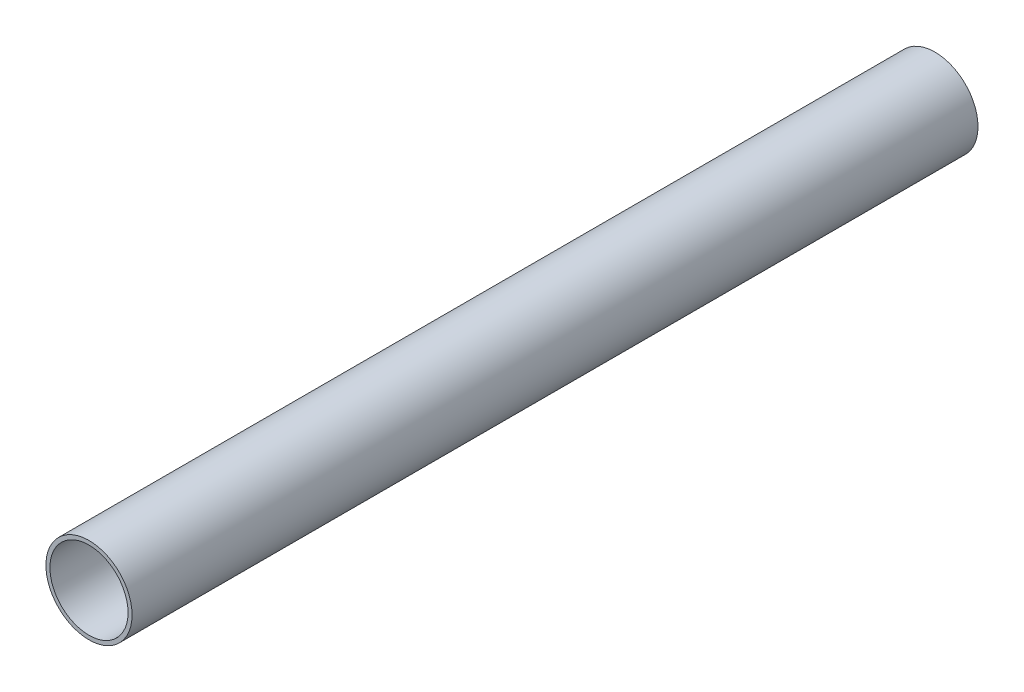
ISO-10303-21;
HEADER;
FILE_DESCRIPTION(('STEP AP214'),'2;1');
FILE_NAME('part.step','',(''),(''),'','','');
FILE_SCHEMA(('AUTOMOTIVE_DESIGN { 1 0 10303 214 1 1 1 1 }'));
ENDSEC;
DATA;
#1=APPLICATION_CONTEXT('core data for automotive mechanical design processes');
#2=APPLICATION_PROTOCOL_DEFINITION('international standard','automotive_design',2000,#1);
#3=PRODUCT_CONTEXT('',#1,'mechanical');
#4=PRODUCT('Part','Part','',(#3));
#5=PRODUCT_RELATED_PRODUCT_CATEGORY('part','',(#4));
#6=PRODUCT_DEFINITION_FORMATION('','',#4);
#7=PRODUCT_DEFINITION_CONTEXT('part definition',#1,'design');
#8=PRODUCT_DEFINITION('design','',#6,#7);
#9=PRODUCT_DEFINITION_SHAPE('','',#8);
#10=(LENGTH_UNIT() NAMED_UNIT(*) SI_UNIT(.MILLI.,.METRE.));
#11=(NAMED_UNIT(*) PLANE_ANGLE_UNIT() SI_UNIT($,.RADIAN.));
#12=(NAMED_UNIT(*) SI_UNIT($,.STERADIAN.) SOLID_ANGLE_UNIT());
#13=UNCERTAINTY_MEASURE_WITH_UNIT(LENGTH_MEASURE(1.E-05),#10,'distance_accuracy_value','');
#14=(GEOMETRIC_REPRESENTATION_CONTEXT(3) GLOBAL_UNCERTAINTY_ASSIGNED_CONTEXT((#13)) GLOBAL_UNIT_ASSIGNED_CONTEXT((#10,
#11,#12)) REPRESENTATION_CONTEXT('',''));
#15=CARTESIAN_POINT('',(0.,0.,0.));
#16=DIRECTION('',(0.,0.,1.));
#17=DIRECTION('',(1.,0.,0.));
#18=AXIS2_PLACEMENT_3D('',#15,#16,#17);
#19=CARTESIAN_POINT('',(0.,0.,275.));
#20=DIRECTION('',(0.,0.,1.));
#21=DIRECTION('',(1.,0.,0.));
#22=AXIS2_PLACEMENT_3D('',#19,#20,#21);
#23=PLANE('',#22);
#24=CARTESIAN_POINT('',(0.,0.,275.));
#25=DIRECTION('',(0.,0.,1.));
#26=DIRECTION('',(1.,0.,0.));
#27=AXIS2_PLACEMENT_3D('',#24,#25,#26);
#28=CIRCLE('',#27,14.);
#29=CARTESIAN_POINT('',(14.,0.,275.));
#30=VERTEX_POINT('',#29);
#31=EDGE_CURVE('E10',#30,#30,#28,.T.);
#32=ORIENTED_EDGE('',*,*,#31,.T.);
#33=EDGE_LOOP('',(#32));
#34=FACE_BOUND('',#33,.T.);
#35=CARTESIAN_POINT('',(0.,0.,275.));
#36=DIRECTION('',(0.,0.,1.));
#37=DIRECTION('',(1.,0.,0.));
#38=AXIS2_PLACEMENT_3D('',#35,#36,#37);
#39=CIRCLE('',#38,12.7);
#40=CARTESIAN_POINT('',(12.7,0.,275.));
#41=VERTEX_POINT('',#40);
#42=EDGE_CURVE('E45',#41,#41,#39,.T.);
#43=ORIENTED_EDGE('',*,*,#42,.F.);
#44=EDGE_LOOP('',(#43));
#45=FACE_BOUND('',#44,.T.);
#46=ADVANCED_FACE('F34',(#34,#45),#23,.T.);
#47=CARTESIAN_POINT('',(0.,0.,0.));
#48=DIRECTION('',(0.,0.,1.));
#49=DIRECTION('',(1.,0.,0.));
#50=AXIS2_PLACEMENT_3D('',#47,#48,#49);
#51=PLANE('',#50);
#52=CARTESIAN_POINT('',(0.,0.,0.));
#53=DIRECTION('',(0.,0.,1.));
#54=DIRECTION('',(1.,0.,0.));
#55=AXIS2_PLACEMENT_3D('',#52,#53,#54);
#56=CIRCLE('',#55,14.);
#57=CARTESIAN_POINT('',(14.,0.,0.));
#58=VERTEX_POINT('',#57);
#59=EDGE_CURVE('E38',#58,#58,#56,.T.);
#60=ORIENTED_EDGE('',*,*,#59,.F.);
#61=EDGE_LOOP('',(#60));
#62=FACE_BOUND('',#61,.T.);
#63=CARTESIAN_POINT('',(0.,0.,0.));
#64=DIRECTION('',(0.,0.,1.));
#65=DIRECTION('',(1.,0.,0.));
#66=AXIS2_PLACEMENT_3D('',#63,#64,#65);
#67=CIRCLE('',#66,12.7);
#68=CARTESIAN_POINT('',(12.7,0.,0.));
#69=VERTEX_POINT('',#68);
#70=EDGE_CURVE('E47',#69,#69,#67,.T.);
#71=ORIENTED_EDGE('',*,*,#70,.T.);
#72=EDGE_LOOP('',(#71));
#73=FACE_BOUND('',#72,.T.);
#74=ADVANCED_FACE('F57',(#62,#73),#51,.F.);
#75=CARTESIAN_POINT('',(0.,0.,275.));
#76=DIRECTION('',(0.,0.,-1.));
#77=DIRECTION('',(-1.,0.,0.));
#78=AXIS2_PLACEMENT_3D('',#75,#76,#77);
#79=CYLINDRICAL_SURFACE('',#78,14.);
#80=ORIENTED_EDGE('',*,*,#31,.F.);
#81=EDGE_LOOP('',(#80));
#82=FACE_BOUND('',#81,.T.);
#83=ORIENTED_EDGE('',*,*,#59,.T.);
#84=EDGE_LOOP('',(#83));
#85=FACE_BOUND('',#84,.T.);
#86=ADVANCED_FACE('F36',(#82,#85),#79,.T.);
#87=CARTESIAN_POINT('',(0.,0.,275.));
#88=DIRECTION('',(0.,0.,-1.));
#89=DIRECTION('',(-1.,0.,0.));
#90=AXIS2_PLACEMENT_3D('',#87,#88,#89);
#91=CYLINDRICAL_SURFACE('',#90,12.7);
#92=ORIENTED_EDGE('',*,*,#42,.T.);
#93=EDGE_LOOP('',(#92));
#94=FACE_BOUND('',#93,.T.);
#95=ORIENTED_EDGE('',*,*,#70,.F.);
#96=EDGE_LOOP('',(#95));
#97=FACE_BOUND('',#96,.T.);
#98=ADVANCED_FACE('F53',(#94,#97),#91,.F.);
#99=CLOSED_SHELL('',(#46,#74,#86,#98));
#100=MANIFOLD_SOLID_BREP('B2',#99);
#101=ADVANCED_BREP_SHAPE_REPRESENTATION('',(#18,#100),#14);
#102=SHAPE_DEFINITION_REPRESENTATION(#9,#101);
ENDSEC;
END-ISO-10303-21;
